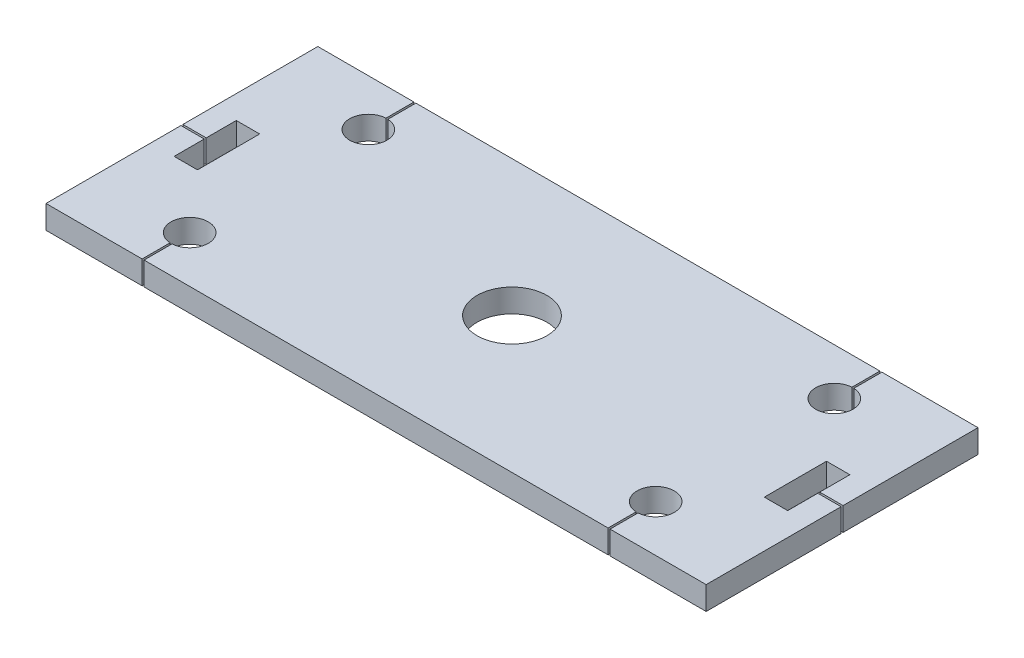
ISO-10303-21;
HEADER;
FILE_DESCRIPTION(('STEP AP214'),'2;1');
FILE_NAME('part.step','',(''),(''),'','','');
FILE_SCHEMA(('AUTOMOTIVE_DESIGN { 1 0 10303 214 1 1 1 1 }'));
ENDSEC;
DATA;
#1=APPLICATION_CONTEXT('core data for automotive mechanical design processes');
#2=APPLICATION_PROTOCOL_DEFINITION('international standard','automotive_design',2000,#1);
#3=PRODUCT_CONTEXT('',#1,'mechanical');
#4=PRODUCT('Part','Part','',(#3));
#5=PRODUCT_RELATED_PRODUCT_CATEGORY('part','',(#4));
#6=PRODUCT_DEFINITION_FORMATION('','',#4);
#7=PRODUCT_DEFINITION_CONTEXT('part definition',#1,'design');
#8=PRODUCT_DEFINITION('design','',#6,#7);
#9=PRODUCT_DEFINITION_SHAPE('','',#8);
#10=(LENGTH_UNIT() NAMED_UNIT(*) SI_UNIT(.MILLI.,.METRE.));
#11=(NAMED_UNIT(*) PLANE_ANGLE_UNIT() SI_UNIT($,.RADIAN.));
#12=(NAMED_UNIT(*) SI_UNIT($,.STERADIAN.) SOLID_ANGLE_UNIT());
#13=UNCERTAINTY_MEASURE_WITH_UNIT(LENGTH_MEASURE(1.E-05),#10,'distance_accuracy_value','');
#14=(GEOMETRIC_REPRESENTATION_CONTEXT(3) GLOBAL_UNCERTAINTY_ASSIGNED_CONTEXT((#13)) GLOBAL_UNIT_ASSIGNED_CONTEXT((#10,
#11,#12)) REPRESENTATION_CONTEXT('',''));
#15=CARTESIAN_POINT('',(0.,0.,0.));
#16=DIRECTION('',(0.,0.,1.));
#17=DIRECTION('',(1.,0.,0.));
#18=AXIS2_PLACEMENT_3D('',#15,#16,#17);
#19=CARTESIAN_POINT('',(42.5,3.,-17.5));
#20=DIRECTION('',(0.,0.,1.));
#21=DIRECTION('',(1.,0.,0.));
#22=AXIS2_PLACEMENT_3D('',#19,#20,#21);
#23=PLANE('',#22);
#24=DIRECTION('',(-1.,0.,0.));
#25=VECTOR('',#24,1.);
#26=CARTESIAN_POINT('',(42.5,0.,-17.5));
#27=LINE('',#26,#25);
#28=CARTESIAN_POINT('',(42.5,0.,-17.5));
#29=VERTEX_POINT('',#28);
#30=CARTESIAN_POINT('',(30.125,0.,-17.5));
#31=VERTEX_POINT('',#30);
#32=EDGE_CURVE('E287',#29,#31,#27,.T.);
#33=ORIENTED_EDGE('',*,*,#32,.T.);
#34=DIRECTION('',(0.,1.,0.));
#35=VECTOR('',#34,1.);
#36=CARTESIAN_POINT('',(30.125,0.,-17.5));
#37=LINE('',#36,#35);
#38=CARTESIAN_POINT('',(30.125,3.,-17.5));
#39=VERTEX_POINT('',#38);
#40=EDGE_CURVE('E270',#31,#39,#37,.T.);
#41=ORIENTED_EDGE('',*,*,#40,.T.);
#42=DIRECTION('',(-1.,0.,0.));
#43=VECTOR('',#42,1.);
#44=CARTESIAN_POINT('',(42.5,3.,-17.5));
#45=LINE('',#44,#43);
#46=CARTESIAN_POINT('',(42.5,3.,-17.5));
#47=VERTEX_POINT('',#46);
#48=EDGE_CURVE('E325',#47,#39,#45,.T.);
#49=ORIENTED_EDGE('',*,*,#48,.F.);
#50=DIRECTION('',(0.,-1.,0.));
#51=VECTOR('',#50,1.);
#52=CARTESIAN_POINT('',(42.5,3.,-17.5));
#53=LINE('',#52,#51);
#54=EDGE_CURVE('E294',#47,#29,#53,.T.);
#55=ORIENTED_EDGE('',*,*,#54,.T.);
#56=EDGE_LOOP('',(#33,#41,#49,#55));
#57=FACE_BOUND('',#56,.T.);
#58=ADVANCED_FACE('F37',(#57),#23,.F.);
#59=CARTESIAN_POINT('',(42.5,3.,-17.5));
#60=DIRECTION('',(-1.,0.,0.));
#61=DIRECTION('',(0.,0.,1.));
#62=AXIS2_PLACEMENT_3D('',#59,#60,#61);
#63=PLANE('',#62);
#64=DIRECTION('',(0.,0.,-1.));
#65=VECTOR('',#64,1.);
#66=CARTESIAN_POINT('',(42.5,3.,-17.5));
#67=LINE('',#66,#65);
#68=CARTESIAN_POINT('',(42.5,3.,-0.125));
#69=VERTEX_POINT('',#68);
#70=EDGE_CURVE('E333',#69,#47,#67,.T.);
#71=ORIENTED_EDGE('',*,*,#70,.F.);
#72=DIRECTION('',(0.,1.,0.));
#73=VECTOR('',#72,1.);
#74=CARTESIAN_POINT('',(42.5,0.,-0.125));
#75=LINE('',#74,#73);
#76=CARTESIAN_POINT('',(42.5,0.,-0.125));
#77=VERTEX_POINT('',#76);
#78=EDGE_CURVE('E520',#77,#69,#75,.T.);
#79=ORIENTED_EDGE('',*,*,#78,.F.);
#80=DIRECTION('',(0.,0.,-1.));
#81=VECTOR('',#80,1.);
#82=CARTESIAN_POINT('',(42.5,0.,-17.5));
#83=LINE('',#82,#81);
#84=EDGE_CURVE('E310',#77,#29,#83,.T.);
#85=ORIENTED_EDGE('',*,*,#84,.T.);
#86=ORIENTED_EDGE('',*,*,#54,.F.);
#87=EDGE_LOOP('',(#71,#79,#85,#86));
#88=FACE_BOUND('',#87,.T.);
#89=ADVANCED_FACE('F715',(#88),#63,.F.);
#90=CARTESIAN_POINT('',(39.5,3.,4.0025));
#91=DIRECTION('',(1.,0.,0.));
#92=DIRECTION('',(0.,0.,-1.));
#93=AXIS2_PLACEMENT_3D('',#90,#91,#92);
#94=PLANE('',#93);
#95=DIRECTION('',(0.,0.,1.));
#96=VECTOR('',#95,1.);
#97=CARTESIAN_POINT('',(39.5,0.,4.0025));
#98=LINE('',#97,#96);
#99=CARTESIAN_POINT('',(39.5,0.,-4.0025));
#100=VERTEX_POINT('',#99);
#101=CARTESIAN_POINT('',(39.5,0.,-0.12500000000002));
#102=VERTEX_POINT('',#101);
#103=EDGE_CURVE('E390',#100,#102,#98,.T.);
#104=ORIENTED_EDGE('',*,*,#103,.T.);
#105=DIRECTION('',(0.,1.,0.));
#106=VECTOR('',#105,1.);
#107=CARTESIAN_POINT('',(39.5,0.,-0.12500000000002));
#108=LINE('',#107,#106);
#109=CARTESIAN_POINT('',(39.5,3.,-0.12500000000002));
#110=VERTEX_POINT('',#109);
#111=EDGE_CURVE('E536',#102,#110,#108,.T.);
#112=ORIENTED_EDGE('',*,*,#111,.T.);
#113=DIRECTION('',(0.,0.,1.));
#114=VECTOR('',#113,1.);
#115=CARTESIAN_POINT('',(39.5,3.,4.0025));
#116=LINE('',#115,#114);
#117=CARTESIAN_POINT('',(39.5,3.,-4.0025));
#118=VERTEX_POINT('',#117);
#119=EDGE_CURVE('E402',#118,#110,#116,.T.);
#120=ORIENTED_EDGE('',*,*,#119,.F.);
#121=DIRECTION('',(0.,-1.,0.));
#122=VECTOR('',#121,1.);
#123=CARTESIAN_POINT('',(39.5,3.,-4.0025));
#124=LINE('',#123,#122);
#125=EDGE_CURVE('E379',#118,#100,#124,.T.);
#126=ORIENTED_EDGE('',*,*,#125,.T.);
#127=EDGE_LOOP('',(#104,#112,#120,#126));
#128=FACE_BOUND('',#127,.T.);
#129=ADVANCED_FACE('F717',(#128),#94,.F.);
#130=CARTESIAN_POINT('',(42.5,3.,17.5));
#131=DIRECTION('',(0.,0.,-1.));
#132=DIRECTION('',(-1.,0.,0.));
#133=AXIS2_PLACEMENT_3D('',#130,#131,#132);
#134=PLANE('',#133);
#135=DIRECTION('',(1.,0.,0.));
#136=VECTOR('',#135,1.);
#137=CARTESIAN_POINT('',(42.5,0.,17.5));
#138=LINE('',#137,#136);
#139=CARTESIAN_POINT('',(-29.875,0.,17.5));
#140=VERTEX_POINT('',#139);
#141=CARTESIAN_POINT('',(29.875,0.,17.5));
#142=VERTEX_POINT('',#141);
#143=EDGE_CURVE('E319',#140,#142,#138,.T.);
#144=ORIENTED_EDGE('',*,*,#143,.T.);
#145=DIRECTION('',(0.,1.,0.));
#146=VECTOR('',#145,1.);
#147=CARTESIAN_POINT('',(29.875,0.,17.5));
#148=LINE('',#147,#146);
#149=CARTESIAN_POINT('',(29.875,3.,17.5));
#150=VERTEX_POINT('',#149);
#151=EDGE_CURVE('E497',#142,#150,#148,.T.);
#152=ORIENTED_EDGE('',*,*,#151,.T.);
#153=DIRECTION('',(1.,0.,0.));
#154=VECTOR('',#153,1.);
#155=CARTESIAN_POINT('',(42.5,3.,17.5));
#156=LINE('',#155,#154);
#157=CARTESIAN_POINT('',(-29.875,3.,17.5));
#158=VERTEX_POINT('',#157);
#159=EDGE_CURVE('E336',#158,#150,#156,.T.);
#160=ORIENTED_EDGE('',*,*,#159,.F.);
#161=DIRECTION('',(0.,1.,0.));
#162=VECTOR('',#161,1.);
#163=CARTESIAN_POINT('',(-29.875,0.,17.5));
#164=LINE('',#163,#162);
#165=EDGE_CURVE('E493',#140,#158,#164,.T.);
#166=ORIENTED_EDGE('',*,*,#165,.F.);
#167=EDGE_LOOP('',(#144,#152,#160,#166));
#168=FACE_BOUND('',#167,.T.);
#169=ADVANCED_FACE('F698',(#168),#134,.F.);
#170=CARTESIAN_POINT('',(-42.5,0.,17.5));
#171=VERTEX_POINT('',#170);
#172=CARTESIAN_POINT('',(-30.125,0.,17.5));
#173=VERTEX_POINT('',#172);
#174=EDGE_CURVE('E315',#171,#173,#138,.T.);
#175=ORIENTED_EDGE('',*,*,#174,.T.);
#176=DIRECTION('',(0.,1.,0.));
#177=VECTOR('',#176,1.);
#178=CARTESIAN_POINT('',(-30.125,0.,17.5));
#179=LINE('',#178,#177);
#180=CARTESIAN_POINT('',(-30.125,3.,17.5));
#181=VERTEX_POINT('',#180);
#182=EDGE_CURVE('E477',#173,#181,#179,.T.);
#183=ORIENTED_EDGE('',*,*,#182,.T.);
#184=CARTESIAN_POINT('',(-42.5,3.,17.5));
#185=VERTEX_POINT('',#184);
#186=EDGE_CURVE('E334',#185,#181,#156,.T.);
#187=ORIENTED_EDGE('',*,*,#186,.F.);
#188=DIRECTION('',(0.,-1.,0.));
#189=VECTOR('',#188,1.);
#190=CARTESIAN_POINT('',(-42.5,3.,17.5));
#191=LINE('',#190,#189);
#192=EDGE_CURVE('E11',#185,#171,#191,.T.);
#193=ORIENTED_EDGE('',*,*,#192,.T.);
#194=EDGE_LOOP('',(#175,#183,#187,#193));
#195=FACE_BOUND('',#194,.T.);
#196=ADVANCED_FACE('F629',(#195),#134,.F.);
#197=CARTESIAN_POINT('',(-42.5,3.,-17.5));
#198=DIRECTION('',(1.,0.,0.));
#199=DIRECTION('',(0.,0.,-1.));
#200=AXIS2_PLACEMENT_3D('',#197,#198,#199);
#201=PLANE('',#200);
#202=DIRECTION('',(0.,0.,1.));
#203=VECTOR('',#202,1.);
#204=CARTESIAN_POINT('',(-42.5,3.,-17.5));
#205=LINE('',#204,#203);
#206=CARTESIAN_POINT('',(-42.5,3.,0.125));
#207=VERTEX_POINT('',#206);
#208=EDGE_CURVE('E295',#207,#185,#205,.T.);
#209=ORIENTED_EDGE('',*,*,#208,.F.);
#210=DIRECTION('',(0.,1.,0.));
#211=VECTOR('',#210,1.);
#212=CARTESIAN_POINT('',(-42.5,0.,0.125));
#213=LINE('',#212,#211);
#214=CARTESIAN_POINT('',(-42.5,0.,0.125));
#215=VERTEX_POINT('',#214);
#216=EDGE_CURVE('E458',#215,#207,#213,.T.);
#217=ORIENTED_EDGE('',*,*,#216,.F.);
#218=DIRECTION('',(0.,0.,1.));
#219=VECTOR('',#218,1.);
#220=CARTESIAN_POINT('',(-42.5,0.,-17.5));
#221=LINE('',#220,#219);
#222=EDGE_CURVE('E324',#215,#171,#221,.T.);
#223=ORIENTED_EDGE('',*,*,#222,.T.);
#224=ORIENTED_EDGE('',*,*,#192,.F.);
#225=EDGE_LOOP('',(#209,#217,#223,#224));
#226=FACE_BOUND('',#225,.T.);
#227=ADVANCED_FACE('F625',(#226),#201,.F.);
#228=CARTESIAN_POINT('',(-39.5,3.,4.0025));
#229=DIRECTION('',(-1.,0.,0.));
#230=DIRECTION('',(0.,0.,1.));
#231=AXIS2_PLACEMENT_3D('',#228,#229,#230);
#232=PLANE('',#231);
#233=DIRECTION('',(0.,0.,-1.));
#234=VECTOR('',#233,1.);
#235=CARTESIAN_POINT('',(-39.5,0.,4.0025));
#236=LINE('',#235,#234);
#237=CARTESIAN_POINT('',(-39.5,0.,4.0025));
#238=VERTEX_POINT('',#237);
#239=CARTESIAN_POINT('',(-39.5,0.,0.125));
#240=VERTEX_POINT('',#239);
#241=EDGE_CURVE('E355',#238,#240,#236,.T.);
#242=ORIENTED_EDGE('',*,*,#241,.T.);
#243=DIRECTION('',(0.,1.,0.));
#244=VECTOR('',#243,1.);
#245=CARTESIAN_POINT('',(-39.5,0.,0.125));
#246=LINE('',#245,#244);
#247=CARTESIAN_POINT('',(-39.5,3.,0.125));
#248=VERTEX_POINT('',#247);
#249=EDGE_CURVE('E435',#240,#248,#246,.T.);
#250=ORIENTED_EDGE('',*,*,#249,.T.);
#251=DIRECTION('',(0.,0.,-1.));
#252=VECTOR('',#251,1.);
#253=CARTESIAN_POINT('',(-39.5,3.,4.0025));
#254=LINE('',#253,#252);
#255=CARTESIAN_POINT('',(-39.5,3.,4.0025));
#256=VERTEX_POINT('',#255);
#257=EDGE_CURVE('E367',#256,#248,#254,.T.);
#258=ORIENTED_EDGE('',*,*,#257,.F.);
#259=DIRECTION('',(0.,-1.,0.));
#260=VECTOR('',#259,1.);
#261=CARTESIAN_POINT('',(-39.5,3.,4.0025));
#262=LINE('',#261,#260);
#263=EDGE_CURVE('E343',#256,#238,#262,.T.);
#264=ORIENTED_EDGE('',*,*,#263,.T.);
#265=EDGE_LOOP('',(#242,#250,#258,#264));
#266=FACE_BOUND('',#265,.T.);
#267=ADVANCED_FACE('F617',(#266),#232,.F.);
#268=CARTESIAN_POINT('',(29.875,3.,-17.5));
#269=VERTEX_POINT('',#268);
#270=CARTESIAN_POINT('',(-29.875,3.,-17.5));
#271=VERTEX_POINT('',#270);
#272=EDGE_CURVE('E328',#269,#271,#45,.T.);
#273=ORIENTED_EDGE('',*,*,#272,.F.);
#274=DIRECTION('',(0.,1.,0.));
#275=VECTOR('',#274,1.);
#276=CARTESIAN_POINT('',(29.875,0.,-17.5));
#277=LINE('',#276,#275);
#278=CARTESIAN_POINT('',(29.875,0.,-17.5));
#279=VERTEX_POINT('',#278);
#280=EDGE_CURVE('E278',#279,#269,#277,.T.);
#281=ORIENTED_EDGE('',*,*,#280,.F.);
#282=CARTESIAN_POINT('',(-29.875,0.,-17.5));
#283=VERTEX_POINT('',#282);
#284=EDGE_CURVE('E296',#279,#283,#27,.T.);
#285=ORIENTED_EDGE('',*,*,#284,.T.);
#286=DIRECTION('',(0.,1.,0.));
#287=VECTOR('',#286,1.);
#288=CARTESIAN_POINT('',(-29.875,0.,-17.5));
#289=LINE('',#288,#287);
#290=EDGE_CURVE('E418',#283,#271,#289,.T.);
#291=ORIENTED_EDGE('',*,*,#290,.T.);
#292=EDGE_LOOP('',(#273,#281,#285,#291));
#293=FACE_BOUND('',#292,.T.);
#294=ADVANCED_FACE('F584',(#293),#23,.F.);
#295=CARTESIAN_POINT('',(-42.5,0.,-17.5));
#296=VERTEX_POINT('',#295);
#297=CARTESIAN_POINT('',(-42.5,0.,-0.125));
#298=VERTEX_POINT('',#297);
#299=EDGE_CURVE('E321',#296,#298,#221,.T.);
#300=ORIENTED_EDGE('',*,*,#299,.T.);
#301=DIRECTION('',(0.,1.,0.));
#302=VECTOR('',#301,1.);
#303=CARTESIAN_POINT('',(-42.5,0.,-0.125));
#304=LINE('',#303,#302);
#305=CARTESIAN_POINT('',(-42.5,3.,-0.125));
#306=VERTEX_POINT('',#305);
#307=EDGE_CURVE('E454',#298,#306,#304,.T.);
#308=ORIENTED_EDGE('',*,*,#307,.T.);
#309=CARTESIAN_POINT('',(-42.5,3.,-17.5));
#310=VERTEX_POINT('',#309);
#311=EDGE_CURVE('E299',#310,#306,#205,.T.);
#312=ORIENTED_EDGE('',*,*,#311,.F.);
#313=DIRECTION('',(0.,-1.,0.));
#314=VECTOR('',#313,1.);
#315=CARTESIAN_POINT('',(-42.5,3.,-17.5));
#316=LINE('',#315,#314);
#317=EDGE_CURVE('E327',#310,#296,#316,.T.);
#318=ORIENTED_EDGE('',*,*,#317,.T.);
#319=EDGE_LOOP('',(#300,#308,#312,#318));
#320=FACE_BOUND('',#319,.T.);
#321=ADVANCED_FACE('F39',(#320),#201,.F.);
#322=CARTESIAN_POINT('',(30.125,3.,17.5));
#323=VERTEX_POINT('',#322);
#324=CARTESIAN_POINT('',(42.5,3.,17.5));
#325=VERTEX_POINT('',#324);
#326=EDGE_CURVE('E337',#323,#325,#156,.T.);
#327=ORIENTED_EDGE('',*,*,#326,.F.);
#328=DIRECTION('',(0.,1.,0.));
#329=VECTOR('',#328,1.);
#330=CARTESIAN_POINT('',(30.125,0.,17.5));
#331=LINE('',#330,#329);
#332=CARTESIAN_POINT('',(30.125,0.,17.5));
#333=VERTEX_POINT('',#332);
#334=EDGE_CURVE('E515',#333,#323,#331,.T.);
#335=ORIENTED_EDGE('',*,*,#334,.F.);
#336=CARTESIAN_POINT('',(42.5,0.,17.5));
#337=VERTEX_POINT('',#336);
#338=EDGE_CURVE('E320',#333,#337,#138,.T.);
#339=ORIENTED_EDGE('',*,*,#338,.T.);
#340=DIRECTION('',(0.,-1.,0.));
#341=VECTOR('',#340,1.);
#342=CARTESIAN_POINT('',(42.5,3.,17.5));
#343=LINE('',#342,#341);
#344=EDGE_CURVE('E46',#325,#337,#343,.T.);
#345=ORIENTED_EDGE('',*,*,#344,.F.);
#346=EDGE_LOOP('',(#327,#335,#339,#345));
#347=FACE_BOUND('',#346,.T.);
#348=ADVANCED_FACE('F708',(#347),#134,.F.);
#349=CARTESIAN_POINT('',(42.5,0.,0.125));
#350=VERTEX_POINT('',#349);
#351=EDGE_CURVE('E303',#337,#350,#83,.T.);
#352=ORIENTED_EDGE('',*,*,#351,.T.);
#353=DIRECTION('',(0.,1.,0.));
#354=VECTOR('',#353,1.);
#355=CARTESIAN_POINT('',(42.5,0.,0.125));
#356=LINE('',#355,#354);
#357=CARTESIAN_POINT('',(42.5,3.,0.125));
#358=VERTEX_POINT('',#357);
#359=EDGE_CURVE('E542',#350,#358,#356,.T.);
#360=ORIENTED_EDGE('',*,*,#359,.T.);
#361=EDGE_CURVE('E330',#325,#358,#67,.T.);
#362=ORIENTED_EDGE('',*,*,#361,.F.);
#363=ORIENTED_EDGE('',*,*,#344,.T.);
#364=EDGE_LOOP('',(#352,#360,#362,#363));
#365=FACE_BOUND('',#364,.T.);
#366=ADVANCED_FACE('F674',(#365),#63,.F.);
#367=CARTESIAN_POINT('',(-30.125,3.,-17.5));
#368=VERTEX_POINT('',#367);
#369=EDGE_CURVE('E329',#368,#310,#45,.T.);
#370=ORIENTED_EDGE('',*,*,#369,.F.);
#371=DIRECTION('',(0.,1.,0.));
#372=VECTOR('',#371,1.);
#373=CARTESIAN_POINT('',(-30.125,0.,-17.5));
#374=LINE('',#373,#372);
#375=CARTESIAN_POINT('',(-30.125,0.,-17.5));
#376=VERTEX_POINT('',#375);
#377=EDGE_CURVE('E430',#376,#368,#374,.T.);
#378=ORIENTED_EDGE('',*,*,#377,.F.);
#379=EDGE_CURVE('E298',#376,#296,#27,.T.);
#380=ORIENTED_EDGE('',*,*,#379,.T.);
#381=ORIENTED_EDGE('',*,*,#317,.F.);
#382=EDGE_LOOP('',(#370,#378,#380,#381));
#383=FACE_BOUND('',#382,.T.);
#384=ADVANCED_FACE('F591',(#383),#23,.F.);
#385=CARTESIAN_POINT('',(0.,3.,0.));
#386=DIRECTION('',(0.,-1.,0.));
#387=DIRECTION('',(0.,0.,-1.));
#388=AXIS2_PLACEMENT_3D('',#385,#386,#387);
#389=PLANE('',#388);
#390=CARTESIAN_POINT('',(0.,3.,0.));
#391=DIRECTION('',(0.,1.,0.));
#392=DIRECTION('',(0.,0.,1.));
#393=AXIS2_PLACEMENT_3D('',#390,#391,#392);
#394=CIRCLE('',#393,4.5);
#395=CARTESIAN_POINT('',(0.,3.,4.5));
#396=VERTEX_POINT('',#395);
#397=EDGE_CURVE('E415',#396,#396,#394,.T.);
#398=ORIENTED_EDGE('',*,*,#397,.F.);
#399=EDGE_LOOP('',(#398));
#400=FACE_BOUND('',#399,.T.);
#401=ORIENTED_EDGE('',*,*,#48,.T.);
#402=DIRECTION('',(0.,0.,-1.));
#403=VECTOR('',#402,1.);
#404=CARTESIAN_POINT('',(30.125,3.,-17.5));
#405=LINE('',#404,#403);
#406=CARTESIAN_POINT('',(30.125,3.,-13.8967425810879));
#407=VERTEX_POINT('',#406);
#408=EDGE_CURVE('E273',#407,#39,#405,.T.);
#409=ORIENTED_EDGE('',*,*,#408,.F.);
#410=CARTESIAN_POINT('',(30.,3.,-11.5));
#411=DIRECTION('',(0.,-1.,0.));
#412=DIRECTION('',(0.,0.,-1.));
#413=AXIS2_PLACEMENT_3D('',#410,#411,#412);
#414=CIRCLE('',#413,2.4);
#415=CARTESIAN_POINT('',(29.8750000000005,3.,-13.8967425810879));
#416=VERTEX_POINT('',#415);
#417=EDGE_CURVE('E583',#407,#416,#414,.T.);
#418=ORIENTED_EDGE('',*,*,#417,.T.);
#419=DIRECTION('',(0.,0.,1.));
#420=VECTOR('',#419,1.);
#421=CARTESIAN_POINT('',(29.875,3.,-17.5));
#422=LINE('',#421,#420);
#423=EDGE_CURVE('E62',#269,#416,#422,.T.);
#424=ORIENTED_EDGE('',*,*,#423,.F.);
#425=ORIENTED_EDGE('',*,*,#272,.T.);
#426=DIRECTION('',(0.,0.,-1.));
#427=VECTOR('',#426,1.);
#428=CARTESIAN_POINT('',(-29.875,3.,-17.5));
#429=LINE('',#428,#427);
#430=CARTESIAN_POINT('',(-29.875,3.,-13.8967425810879));
#431=VERTEX_POINT('',#430);
#432=EDGE_CURVE('E425',#431,#271,#429,.T.);
#433=ORIENTED_EDGE('',*,*,#432,.F.);
#434=CARTESIAN_POINT('',(-30.,3.,-11.5));
#435=DIRECTION('',(0.,-1.,0.));
#436=DIRECTION('',(0.,0.,-1.));
#437=AXIS2_PLACEMENT_3D('',#434,#435,#436);
#438=CIRCLE('',#437,2.4);
#439=CARTESIAN_POINT('',(-30.1249999999999,3.,-13.8967425810879));
#440=VERTEX_POINT('',#439);
#441=EDGE_CURVE('E644',#431,#440,#438,.T.);
#442=ORIENTED_EDGE('',*,*,#441,.T.);
#443=DIRECTION('',(0.,0.,1.));
#444=VECTOR('',#443,1.);
#445=CARTESIAN_POINT('',(-30.125,3.,-17.5));
#446=LINE('',#445,#444);
#447=EDGE_CURVE('E433',#368,#440,#446,.T.);
#448=ORIENTED_EDGE('',*,*,#447,.F.);
#449=ORIENTED_EDGE('',*,*,#369,.T.);
#450=ORIENTED_EDGE('',*,*,#311,.T.);
#451=DIRECTION('',(-1.,0.,0.));
#452=VECTOR('',#451,1.);
#453=CARTESIAN_POINT('',(-39.5,3.,-0.125));
#454=LINE('',#453,#452);
#455=CARTESIAN_POINT('',(-39.5,3.,-0.125));
#456=VERTEX_POINT('',#455);
#457=EDGE_CURVE('E465',#456,#306,#454,.T.);
#458=ORIENTED_EDGE('',*,*,#457,.F.);
#459=CARTESIAN_POINT('',(-39.5,3.,-4.0025));
#460=VERTEX_POINT('',#459);
#461=EDGE_CURVE('E370',#456,#460,#254,.T.);
#462=ORIENTED_EDGE('',*,*,#461,.T.);
#463=DIRECTION('',(1.,0.,0.));
#464=VECTOR('',#463,1.);
#465=CARTESIAN_POINT('',(-36.49,3.,-4.0025));
#466=LINE('',#465,#464);
#467=CARTESIAN_POINT('',(-36.49,3.,-4.0025));
#468=VERTEX_POINT('',#467);
#469=EDGE_CURVE('E344',#460,#468,#466,.T.);
#470=ORIENTED_EDGE('',*,*,#469,.T.);
#471=DIRECTION('',(0.,0.,1.));
#472=VECTOR('',#471,1.);
#473=CARTESIAN_POINT('',(-36.49,3.,4.0025));
#474=LINE('',#473,#472);
#475=CARTESIAN_POINT('',(-36.49,3.,4.0025));
#476=VERTEX_POINT('',#475);
#477=EDGE_CURVE('E354',#468,#476,#474,.T.);
#478=ORIENTED_EDGE('',*,*,#477,.T.);
#479=DIRECTION('',(-1.,0.,0.));
#480=VECTOR('',#479,1.);
#481=CARTESIAN_POINT('',(-36.49,3.,4.0025));
#482=LINE('',#481,#480);
#483=EDGE_CURVE('E371',#476,#256,#482,.T.);
#484=ORIENTED_EDGE('',*,*,#483,.T.);
#485=ORIENTED_EDGE('',*,*,#257,.T.);
#486=DIRECTION('',(1.,0.,0.));
#487=VECTOR('',#486,1.);
#488=CARTESIAN_POINT('',(-39.5,3.,0.125));
#489=LINE('',#488,#487);
#490=EDGE_CURVE('E462',#207,#248,#489,.T.);
#491=ORIENTED_EDGE('',*,*,#490,.F.);
#492=ORIENTED_EDGE('',*,*,#208,.T.);
#493=ORIENTED_EDGE('',*,*,#186,.T.);
#494=DIRECTION('',(0.,0.,1.));
#495=VECTOR('',#494,1.);
#496=CARTESIAN_POINT('',(-30.125,3.,17.5));
#497=LINE('',#496,#495);
#498=CARTESIAN_POINT('',(-30.125,3.,13.8967425810879));
#499=VERTEX_POINT('',#498);
#500=EDGE_CURVE('E487',#499,#181,#497,.T.);
#501=ORIENTED_EDGE('',*,*,#500,.F.);
#502=CARTESIAN_POINT('',(-30.,3.,11.5));
#503=DIRECTION('',(0.,-1.,0.));
#504=DIRECTION('',(0.,0.,-1.));
#505=AXIS2_PLACEMENT_3D('',#502,#503,#504);
#506=CIRCLE('',#505,2.4);
#507=CARTESIAN_POINT('',(-29.8750000000006,3.,13.896742581088));
#508=VERTEX_POINT('',#507);
#509=EDGE_CURVE('E634',#499,#508,#506,.T.);
#510=ORIENTED_EDGE('',*,*,#509,.T.);
#511=DIRECTION('',(0.,0.,-1.));
#512=VECTOR('',#511,1.);
#513=CARTESIAN_POINT('',(-29.875,3.,17.5));
#514=LINE('',#513,#512);
#515=EDGE_CURVE('E483',#158,#508,#514,.T.);
#516=ORIENTED_EDGE('',*,*,#515,.F.);
#517=ORIENTED_EDGE('',*,*,#159,.T.);
#518=DIRECTION('',(0.,0.,1.));
#519=VECTOR('',#518,1.);
#520=CARTESIAN_POINT('',(29.875,3.,17.5));
#521=LINE('',#520,#519);
#522=CARTESIAN_POINT('',(29.875,3.,13.8967425810879));
#523=VERTEX_POINT('',#522);
#524=EDGE_CURVE('E510',#523,#150,#521,.T.);
#525=ORIENTED_EDGE('',*,*,#524,.F.);
#526=CARTESIAN_POINT('',(30.,3.,11.5));
#527=DIRECTION('',(0.,-1.,0.));
#528=DIRECTION('',(0.,0.,-1.));
#529=AXIS2_PLACEMENT_3D('',#526,#527,#528);
#530=CIRCLE('',#529,2.4);
#531=CARTESIAN_POINT('',(30.1249999999997,3.,13.8967425810879));
#532=VERTEX_POINT('',#531);
#533=EDGE_CURVE('E399',#523,#532,#530,.T.);
#534=ORIENTED_EDGE('',*,*,#533,.T.);
#535=DIRECTION('',(0.,0.,-1.));
#536=VECTOR('',#535,1.);
#537=CARTESIAN_POINT('',(30.125,3.,17.5));
#538=LINE('',#537,#536);
#539=EDGE_CURVE('E518',#323,#532,#538,.T.);
#540=ORIENTED_EDGE('',*,*,#539,.F.);
#541=ORIENTED_EDGE('',*,*,#326,.T.);
#542=ORIENTED_EDGE('',*,*,#361,.T.);
#543=DIRECTION('',(1.,0.,0.));
#544=VECTOR('',#543,1.);
#545=CARTESIAN_POINT('',(39.5,3.,0.125));
#546=LINE('',#545,#544);
#547=CARTESIAN_POINT('',(39.5,3.,0.125));
#548=VERTEX_POINT('',#547);
#549=EDGE_CURVE('E545',#548,#358,#546,.T.);
#550=ORIENTED_EDGE('',*,*,#549,.F.);
#551=CARTESIAN_POINT('',(39.5,3.,4.0025));
#552=VERTEX_POINT('',#551);
#553=EDGE_CURVE('E405',#548,#552,#116,.T.);
#554=ORIENTED_EDGE('',*,*,#553,.T.);
#555=DIRECTION('',(-1.,0.,0.));
#556=VECTOR('',#555,1.);
#557=CARTESIAN_POINT('',(36.49,3.,4.0025));
#558=LINE('',#557,#556);
#559=CARTESIAN_POINT('',(36.49,3.,4.0025));
#560=VERTEX_POINT('',#559);
#561=EDGE_CURVE('E380',#552,#560,#558,.T.);
#562=ORIENTED_EDGE('',*,*,#561,.T.);
#563=DIRECTION('',(0.,0.,-1.));
#564=VECTOR('',#563,1.);
#565=CARTESIAN_POINT('',(36.49,3.,4.0025));
#566=LINE('',#565,#564);
#567=CARTESIAN_POINT('',(36.49,3.,-4.0025));
#568=VERTEX_POINT('',#567);
#569=EDGE_CURVE('E389',#560,#568,#566,.T.);
#570=ORIENTED_EDGE('',*,*,#569,.T.);
#571=DIRECTION('',(1.,0.,0.));
#572=VECTOR('',#571,1.);
#573=CARTESIAN_POINT('',(36.49,3.,-4.0025));
#574=LINE('',#573,#572);
#575=EDGE_CURVE('E406',#568,#118,#574,.T.);
#576=ORIENTED_EDGE('',*,*,#575,.T.);
#577=ORIENTED_EDGE('',*,*,#119,.T.);
#578=DIRECTION('',(-1.,0.,0.));
#579=VECTOR('',#578,1.);
#580=CARTESIAN_POINT('',(39.5,3.,-0.12500000000002));
#581=LINE('',#580,#579);
#582=EDGE_CURVE('E548',#69,#110,#581,.T.);
#583=ORIENTED_EDGE('',*,*,#582,.F.);
#584=ORIENTED_EDGE('',*,*,#70,.T.);
#585=EDGE_LOOP('',(#401,#409,#418,#424,#425,#433,#442,#448,#449,#450,#458,#462,#470,#478,#484,
#485,#491,#492,#493,#501,#510,#516,#517,#525,#534,#540,#541,#542,#550,#554,#562,#570,#576,#577,
#583,#584));
#586=FACE_BOUND('',#585,.T.);
#587=ADVANCED_FACE('F580',(#400,#586),#389,.F.);
#588=CARTESIAN_POINT('',(0.,0.,0.));
#589=DIRECTION('',(0.,-1.,0.));
#590=DIRECTION('',(0.,0.,-1.));
#591=AXIS2_PLACEMENT_3D('',#588,#589,#590);
#592=PLANE('',#591);
#593=DIRECTION('',(0.,0.,-1.));
#594=VECTOR('',#593,1.);
#595=CARTESIAN_POINT('',(30.125,0.,-17.5));
#596=LINE('',#595,#594);
#597=CARTESIAN_POINT('',(30.125,0.,-13.8967425810879));
#598=VERTEX_POINT('',#597);
#599=EDGE_CURVE('E54',#598,#31,#596,.T.);
#600=ORIENTED_EDGE('',*,*,#599,.T.);
#601=ORIENTED_EDGE('',*,*,#32,.F.);
#602=ORIENTED_EDGE('',*,*,#84,.F.);
#603=DIRECTION('',(-1.,0.,0.));
#604=VECTOR('',#603,1.);
#605=CARTESIAN_POINT('',(39.5,0.,-0.12500000000002));
#606=LINE('',#605,#604);
#607=EDGE_CURVE('E547',#77,#102,#606,.T.);
#608=ORIENTED_EDGE('',*,*,#607,.T.);
#609=ORIENTED_EDGE('',*,*,#103,.F.);
#610=DIRECTION('',(1.,0.,0.));
#611=VECTOR('',#610,1.);
#612=CARTESIAN_POINT('',(36.49,0.,-4.0025));
#613=LINE('',#612,#611);
#614=CARTESIAN_POINT('',(36.49,0.,-4.0025));
#615=VERTEX_POINT('',#614);
#616=EDGE_CURVE('E394',#615,#100,#613,.T.);
#617=ORIENTED_EDGE('',*,*,#616,.F.);
#618=DIRECTION('',(0.,0.,-1.));
#619=VECTOR('',#618,1.);
#620=CARTESIAN_POINT('',(36.49,0.,4.0025));
#621=LINE('',#620,#619);
#622=CARTESIAN_POINT('',(36.49,0.,4.0025));
#623=VERTEX_POINT('',#622);
#624=EDGE_CURVE('E397',#623,#615,#621,.T.);
#625=ORIENTED_EDGE('',*,*,#624,.F.);
#626=DIRECTION('',(-1.,0.,0.));
#627=VECTOR('',#626,1.);
#628=CARTESIAN_POINT('',(36.49,0.,4.0025));
#629=LINE('',#628,#627);
#630=CARTESIAN_POINT('',(39.5,0.,4.0025));
#631=VERTEX_POINT('',#630);
#632=EDGE_CURVE('E386',#631,#623,#629,.T.);
#633=ORIENTED_EDGE('',*,*,#632,.F.);
#634=CARTESIAN_POINT('',(39.5,0.,0.125));
#635=VERTEX_POINT('',#634);
#636=EDGE_CURVE('E393',#635,#631,#98,.T.);
#637=ORIENTED_EDGE('',*,*,#636,.F.);
#638=DIRECTION('',(1.,0.,0.));
#639=VECTOR('',#638,1.);
#640=CARTESIAN_POINT('',(39.5,0.,0.125));
#641=LINE('',#640,#639);
#642=EDGE_CURVE('E540',#635,#350,#641,.T.);
#643=ORIENTED_EDGE('',*,*,#642,.T.);
#644=ORIENTED_EDGE('',*,*,#351,.F.);
#645=ORIENTED_EDGE('',*,*,#338,.F.);
#646=DIRECTION('',(0.,0.,-1.));
#647=VECTOR('',#646,1.);
#648=CARTESIAN_POINT('',(30.125,0.,17.5));
#649=LINE('',#648,#647);
#650=CARTESIAN_POINT('',(30.125,0.,13.8967425810879));
#651=VERTEX_POINT('',#650);
#652=EDGE_CURVE('E506',#333,#651,#649,.T.);
#653=ORIENTED_EDGE('',*,*,#652,.T.);
#654=CARTESIAN_POINT('',(30.,0.,11.5));
#655=DIRECTION('',(0.,-1.,0.));
#656=DIRECTION('',(0.,0.,-1.));
#657=AXIS2_PLACEMENT_3D('',#654,#655,#656);
#658=CIRCLE('',#657,2.39999999999999);
#659=CARTESIAN_POINT('',(29.875,0.,13.8967425810879));
#660=VERTEX_POINT('',#659);
#661=EDGE_CURVE('E656',#660,#651,#658,.T.);
#662=ORIENTED_EDGE('',*,*,#661,.F.);
#663=DIRECTION('',(0.,0.,1.));
#664=VECTOR('',#663,1.);
#665=CARTESIAN_POINT('',(29.875,0.,17.5));
#666=LINE('',#665,#664);
#667=EDGE_CURVE('E509',#660,#142,#666,.T.);
#668=ORIENTED_EDGE('',*,*,#667,.T.);
#669=ORIENTED_EDGE('',*,*,#143,.F.);
#670=DIRECTION('',(0.,0.,-1.));
#671=VECTOR('',#670,1.);
#672=CARTESIAN_POINT('',(-29.875,0.,17.5));
#673=LINE('',#672,#671);
#674=CARTESIAN_POINT('',(-29.875,0.,13.8967425810879));
#675=VERTEX_POINT('',#674);
#676=EDGE_CURVE('E474',#140,#675,#673,.T.);
#677=ORIENTED_EDGE('',*,*,#676,.T.);
#678=CARTESIAN_POINT('',(-30.,0.,11.5));
#679=DIRECTION('',(0.,-1.,0.));
#680=DIRECTION('',(0.,0.,-1.));
#681=AXIS2_PLACEMENT_3D('',#678,#679,#680);
#682=CIRCLE('',#681,2.39999999999999);
#683=CARTESIAN_POINT('',(-30.125,0.,13.8967425810879));
#684=VERTEX_POINT('',#683);
#685=EDGE_CURVE('E414',#684,#675,#682,.T.);
#686=ORIENTED_EDGE('',*,*,#685,.F.);
#687=DIRECTION('',(0.,0.,1.));
#688=VECTOR('',#687,1.);
#689=CARTESIAN_POINT('',(-30.125,0.,17.5));
#690=LINE('',#689,#688);
#691=EDGE_CURVE('E478',#684,#173,#690,.T.);
#692=ORIENTED_EDGE('',*,*,#691,.T.);
#693=ORIENTED_EDGE('',*,*,#174,.F.);
#694=ORIENTED_EDGE('',*,*,#222,.F.);
#695=DIRECTION('',(1.,0.,0.));
#696=VECTOR('',#695,1.);
#697=CARTESIAN_POINT('',(-39.5,0.,0.125));
#698=LINE('',#697,#696);
#699=EDGE_CURVE('E455',#215,#240,#698,.T.);
#700=ORIENTED_EDGE('',*,*,#699,.T.);
#701=ORIENTED_EDGE('',*,*,#241,.F.);
#702=DIRECTION('',(-1.,0.,0.));
#703=VECTOR('',#702,1.);
#704=CARTESIAN_POINT('',(-36.49,0.,4.0025));
#705=LINE('',#704,#703);
#706=CARTESIAN_POINT('',(-36.49,0.,4.0025));
#707=VERTEX_POINT('',#706);
#708=EDGE_CURVE('E359',#707,#238,#705,.T.);
#709=ORIENTED_EDGE('',*,*,#708,.F.);
#710=DIRECTION('',(0.,0.,1.));
#711=VECTOR('',#710,1.);
#712=CARTESIAN_POINT('',(-36.49,0.,4.0025));
#713=LINE('',#712,#711);
#714=CARTESIAN_POINT('',(-36.49,0.,-4.0025));
#715=VERTEX_POINT('',#714);
#716=EDGE_CURVE('E362',#715,#707,#713,.T.);
#717=ORIENTED_EDGE('',*,*,#716,.F.);
#718=DIRECTION('',(1.,0.,0.));
#719=VECTOR('',#718,1.);
#720=CARTESIAN_POINT('',(-36.49,0.,-4.0025));
#721=LINE('',#720,#719);
#722=CARTESIAN_POINT('',(-39.5,0.,-4.0025));
#723=VERTEX_POINT('',#722);
#724=EDGE_CURVE('E351',#723,#715,#721,.T.);
#725=ORIENTED_EDGE('',*,*,#724,.F.);
#726=CARTESIAN_POINT('',(-39.5,0.,-0.125));
#727=VERTEX_POINT('',#726);
#728=EDGE_CURVE('E358',#727,#723,#236,.T.);
#729=ORIENTED_EDGE('',*,*,#728,.F.);
#730=DIRECTION('',(-1.,0.,0.));
#731=VECTOR('',#730,1.);
#732=CARTESIAN_POINT('',(-39.5,0.,-0.125));
#733=LINE('',#732,#731);
#734=EDGE_CURVE('E464',#727,#298,#733,.T.);
#735=ORIENTED_EDGE('',*,*,#734,.T.);
#736=ORIENTED_EDGE('',*,*,#299,.F.);
#737=ORIENTED_EDGE('',*,*,#379,.F.);
#738=DIRECTION('',(0.,0.,1.));
#739=VECTOR('',#738,1.);
#740=CARTESIAN_POINT('',(-30.125,0.,-17.5));
#741=LINE('',#740,#739);
#742=CARTESIAN_POINT('',(-30.125,0.,-13.8967425810879));
#743=VERTEX_POINT('',#742);
#744=EDGE_CURVE('E421',#376,#743,#741,.T.);
#745=ORIENTED_EDGE('',*,*,#744,.T.);
#746=CARTESIAN_POINT('',(-30.,0.,-11.5));
#747=DIRECTION('',(0.,-1.,0.));
#748=DIRECTION('',(0.,0.,-1.));
#749=AXIS2_PLACEMENT_3D('',#746,#747,#748);
#750=CIRCLE('',#749,2.39999999999999);
#751=CARTESIAN_POINT('',(-29.875,0.,-13.8967425810879));
#752=VERTEX_POINT('',#751);
#753=EDGE_CURVE('E641',#752,#743,#750,.T.);
#754=ORIENTED_EDGE('',*,*,#753,.F.);
#755=DIRECTION('',(0.,0.,-1.));
#756=VECTOR('',#755,1.);
#757=CARTESIAN_POINT('',(-29.875,0.,-17.5));
#758=LINE('',#757,#756);
#759=EDGE_CURVE('E424',#752,#283,#758,.T.);
#760=ORIENTED_EDGE('',*,*,#759,.T.);
#761=ORIENTED_EDGE('',*,*,#284,.F.);
#762=DIRECTION('',(0.,0.,1.));
#763=VECTOR('',#762,1.);
#764=CARTESIAN_POINT('',(29.875,0.,-17.5));
#765=LINE('',#764,#763);
#766=CARTESIAN_POINT('',(29.875,0.,-13.8967425810879));
#767=VERTEX_POINT('',#766);
#768=EDGE_CURVE('E279',#279,#767,#765,.T.);
#769=ORIENTED_EDGE('',*,*,#768,.T.);
#770=CARTESIAN_POINT('',(30.,0.,-11.5));
#771=DIRECTION('',(0.,-1.,0.));
#772=DIRECTION('',(0.,0.,-1.));
#773=AXIS2_PLACEMENT_3D('',#770,#771,#772);
#774=CIRCLE('',#773,2.39999999999999);
#775=EDGE_CURVE('E290',#598,#767,#774,.T.);
#776=ORIENTED_EDGE('',*,*,#775,.F.);
#777=EDGE_LOOP('',(#600,#601,#602,#608,#609,#617,#625,#633,#637,#643,#644,#645,#653,#662,#668,
#669,#677,#686,#692,#693,#694,#700,#701,#709,#717,#725,#729,#735,#736,#737,#745,#754,#760,#761,
#769,#776));
#778=FACE_BOUND('',#777,.T.);
#779=CARTESIAN_POINT('',(0.,0.,0.));
#780=DIRECTION('',(0.,1.,0.));
#781=DIRECTION('',(0.,0.,1.));
#782=AXIS2_PLACEMENT_3D('',#779,#780,#781);
#783=CIRCLE('',#782,4.5);
#784=CARTESIAN_POINT('',(0.,0.,4.5));
#785=VERTEX_POINT('',#784);
#786=EDGE_CURVE('E411',#785,#785,#783,.T.);
#787=ORIENTED_EDGE('',*,*,#786,.T.);
#788=EDGE_LOOP('',(#787));
#789=FACE_BOUND('',#788,.T.);
#790=ADVANCED_FACE('F284',(#778,#789),#592,.T.);
#791=CARTESIAN_POINT('',(-36.49,3.,4.0025));
#792=DIRECTION('',(1.,0.,0.));
#793=DIRECTION('',(0.,0.,-1.));
#794=AXIS2_PLACEMENT_3D('',#791,#792,#793);
#795=PLANE('',#794);
#796=ORIENTED_EDGE('',*,*,#716,.T.);
#797=DIRECTION('',(0.,-1.,0.));
#798=VECTOR('',#797,1.);
#799=CARTESIAN_POINT('',(-36.49,3.,4.0025));
#800=LINE('',#799,#798);
#801=EDGE_CURVE('E340',#476,#707,#800,.T.);
#802=ORIENTED_EDGE('',*,*,#801,.F.);
#803=ORIENTED_EDGE('',*,*,#477,.F.);
#804=DIRECTION('',(0.,-1.,0.));
#805=VECTOR('',#804,1.);
#806=CARTESIAN_POINT('',(-36.49,3.,-4.0025));
#807=LINE('',#806,#805);
#808=EDGE_CURVE('E349',#468,#715,#807,.T.);
#809=ORIENTED_EDGE('',*,*,#808,.T.);
#810=EDGE_LOOP('',(#796,#802,#803,#809));
#811=FACE_BOUND('',#810,.T.);
#812=ADVANCED_FACE('F610',(#811),#795,.F.);
#813=CARTESIAN_POINT('',(-36.49,3.,-4.0025));
#814=DIRECTION('',(0.,0.,-1.));
#815=DIRECTION('',(-1.,0.,0.));
#816=AXIS2_PLACEMENT_3D('',#813,#814,#815);
#817=PLANE('',#816);
#818=ORIENTED_EDGE('',*,*,#724,.T.);
#819=ORIENTED_EDGE('',*,*,#808,.F.);
#820=ORIENTED_EDGE('',*,*,#469,.F.);
#821=DIRECTION('',(0.,-1.,0.));
#822=VECTOR('',#821,1.);
#823=CARTESIAN_POINT('',(-39.5,3.,-4.0025));
#824=LINE('',#823,#822);
#825=EDGE_CURVE('E346',#460,#723,#824,.T.);
#826=ORIENTED_EDGE('',*,*,#825,.T.);
#827=EDGE_LOOP('',(#818,#819,#820,#826));
#828=FACE_BOUND('',#827,.T.);
#829=ADVANCED_FACE('F606',(#828),#817,.F.);
#830=ORIENTED_EDGE('',*,*,#461,.F.);
#831=DIRECTION('',(0.,1.,0.));
#832=VECTOR('',#831,1.);
#833=CARTESIAN_POINT('',(-39.5,0.,-0.125));
#834=LINE('',#833,#832);
#835=EDGE_CURVE('E452',#727,#456,#834,.T.);
#836=ORIENTED_EDGE('',*,*,#835,.F.);
#837=ORIENTED_EDGE('',*,*,#728,.T.);
#838=ORIENTED_EDGE('',*,*,#825,.F.);
#839=EDGE_LOOP('',(#830,#836,#837,#838));
#840=FACE_BOUND('',#839,.T.);
#841=ADVANCED_FACE('F603',(#840),#232,.F.);
#842=CARTESIAN_POINT('',(-36.49,3.,4.0025));
#843=DIRECTION('',(0.,0.,1.));
#844=DIRECTION('',(1.,0.,0.));
#845=AXIS2_PLACEMENT_3D('',#842,#843,#844);
#846=PLANE('',#845);
#847=ORIENTED_EDGE('',*,*,#708,.T.);
#848=ORIENTED_EDGE('',*,*,#263,.F.);
#849=ORIENTED_EDGE('',*,*,#483,.F.);
#850=ORIENTED_EDGE('',*,*,#801,.T.);
#851=EDGE_LOOP('',(#847,#848,#849,#850));
#852=FACE_BOUND('',#851,.T.);
#853=ADVANCED_FACE('F614',(#852),#846,.F.);
#854=CARTESIAN_POINT('',(36.49,3.,4.0025));
#855=DIRECTION('',(-1.,0.,0.));
#856=DIRECTION('',(0.,0.,1.));
#857=AXIS2_PLACEMENT_3D('',#854,#855,#856);
#858=PLANE('',#857);
#859=ORIENTED_EDGE('',*,*,#624,.T.);
#860=DIRECTION('',(0.,-1.,0.));
#861=VECTOR('',#860,1.);
#862=CARTESIAN_POINT('',(36.49,3.,-4.0025));
#863=LINE('',#862,#861);
#864=EDGE_CURVE('E376',#568,#615,#863,.T.);
#865=ORIENTED_EDGE('',*,*,#864,.F.);
#866=ORIENTED_EDGE('',*,*,#569,.F.);
#867=DIRECTION('',(0.,-1.,0.));
#868=VECTOR('',#867,1.);
#869=CARTESIAN_POINT('',(36.49,3.,4.0025));
#870=LINE('',#869,#868);
#871=EDGE_CURVE('E364',#560,#623,#870,.T.);
#872=ORIENTED_EDGE('',*,*,#871,.T.);
#873=EDGE_LOOP('',(#859,#865,#866,#872));
#874=FACE_BOUND('',#873,.T.);
#875=ADVANCED_FACE('F742',(#874),#858,.F.);
#876=CARTESIAN_POINT('',(36.49,3.,4.0025));
#877=DIRECTION('',(0.,0.,1.));
#878=DIRECTION('',(1.,0.,0.));
#879=AXIS2_PLACEMENT_3D('',#876,#877,#878);
#880=PLANE('',#879);
#881=ORIENTED_EDGE('',*,*,#632,.T.);
#882=ORIENTED_EDGE('',*,*,#871,.F.);
#883=ORIENTED_EDGE('',*,*,#561,.F.);
#884=DIRECTION('',(0.,-1.,0.));
#885=VECTOR('',#884,1.);
#886=CARTESIAN_POINT('',(39.5,3.,4.0025));
#887=LINE('',#886,#885);
#888=EDGE_CURVE('E382',#552,#631,#887,.T.);
#889=ORIENTED_EDGE('',*,*,#888,.T.);
#890=EDGE_LOOP('',(#881,#882,#883,#889));
#891=FACE_BOUND('',#890,.T.);
#892=ADVANCED_FACE('F749',(#891),#880,.F.);
#893=ORIENTED_EDGE('',*,*,#553,.F.);
#894=DIRECTION('',(0.,1.,0.));
#895=VECTOR('',#894,1.);
#896=CARTESIAN_POINT('',(39.5,0.,0.125));
#897=LINE('',#896,#895);
#898=EDGE_CURVE('E539',#635,#548,#897,.T.);
#899=ORIENTED_EDGE('',*,*,#898,.F.);
#900=ORIENTED_EDGE('',*,*,#636,.T.);
#901=ORIENTED_EDGE('',*,*,#888,.F.);
#902=EDGE_LOOP('',(#893,#899,#900,#901));
#903=FACE_BOUND('',#902,.T.);
#904=ADVANCED_FACE('F686',(#903),#94,.F.);
#905=CARTESIAN_POINT('',(36.49,3.,-4.0025));
#906=DIRECTION('',(0.,0.,-1.));
#907=DIRECTION('',(-1.,0.,0.));
#908=AXIS2_PLACEMENT_3D('',#905,#906,#907);
#909=PLANE('',#908);
#910=ORIENTED_EDGE('',*,*,#616,.T.);
#911=ORIENTED_EDGE('',*,*,#125,.F.);
#912=ORIENTED_EDGE('',*,*,#575,.F.);
#913=ORIENTED_EDGE('',*,*,#864,.T.);
#914=EDGE_LOOP('',(#910,#911,#912,#913));
#915=FACE_BOUND('',#914,.T.);
#916=ADVANCED_FACE('F751',(#915),#909,.F.);
#917=CARTESIAN_POINT('',(30.,0.,11.5));
#918=DIRECTION('',(0.,-1.,0.));
#919=DIRECTION('',(0.,0.,-1.));
#920=AXIS2_PLACEMENT_3D('',#917,#918,#919);
#921=CYLINDRICAL_SURFACE('',#920,2.39999999999999);
#922=ORIENTED_EDGE('',*,*,#533,.F.);
#923=DIRECTION('',(0.,1.,0.));
#924=VECTOR('',#923,1.);
#925=CARTESIAN_POINT('',(29.875,0.,13.8967425810879));
#926=LINE('',#925,#924);
#927=EDGE_CURVE('E526',#660,#523,#926,.T.);
#928=ORIENTED_EDGE('',*,*,#927,.F.);
#929=ORIENTED_EDGE('',*,*,#661,.T.);
#930=DIRECTION('',(0.,1.,0.));
#931=VECTOR('',#930,1.);
#932=CARTESIAN_POINT('',(30.125,0.,13.8967425810879));
#933=LINE('',#932,#931);
#934=EDGE_CURVE('E523',#651,#532,#933,.T.);
#935=ORIENTED_EDGE('',*,*,#934,.T.);
#936=EDGE_LOOP('',(#922,#928,#929,#935));
#937=FACE_BOUND('',#936,.T.);
#938=ADVANCED_FACE('F705',(#937),#921,.F.);
#939=CARTESIAN_POINT('',(30.,0.,-11.5));
#940=DIRECTION('',(0.,-1.,0.));
#941=DIRECTION('',(0.,0.,-1.));
#942=AXIS2_PLACEMENT_3D('',#939,#940,#941);
#943=CYLINDRICAL_SURFACE('',#942,2.39999999999999);
#944=ORIENTED_EDGE('',*,*,#417,.F.);
#945=DIRECTION('',(0.,1.,0.));
#946=VECTOR('',#945,1.);
#947=CARTESIAN_POINT('',(30.125,0.,-13.8967425810879));
#948=LINE('',#947,#946);
#949=EDGE_CURVE('E550',#598,#407,#948,.T.);
#950=ORIENTED_EDGE('',*,*,#949,.F.);
#951=ORIENTED_EDGE('',*,*,#775,.T.);
#952=DIRECTION('',(0.,1.,0.));
#953=VECTOR('',#952,1.);
#954=CARTESIAN_POINT('',(29.875,0.,-13.8967425810879));
#955=LINE('',#954,#953);
#956=EDGE_CURVE('E565',#767,#416,#955,.T.);
#957=ORIENTED_EDGE('',*,*,#956,.T.);
#958=EDGE_LOOP('',(#944,#950,#951,#957));
#959=FACE_BOUND('',#958,.T.);
#960=ADVANCED_FACE('F762',(#959),#943,.F.);
#961=CARTESIAN_POINT('',(-30.,0.,-11.5));
#962=DIRECTION('',(0.,-1.,0.));
#963=DIRECTION('',(0.,0.,-1.));
#964=AXIS2_PLACEMENT_3D('',#961,#962,#963);
#965=CYLINDRICAL_SURFACE('',#964,2.39999999999999);
#966=ORIENTED_EDGE('',*,*,#441,.F.);
#967=DIRECTION('',(0.,1.,0.));
#968=VECTOR('',#967,1.);
#969=CARTESIAN_POINT('',(-29.875,0.,-13.8967425810879));
#970=LINE('',#969,#968);
#971=EDGE_CURVE('E441',#752,#431,#970,.T.);
#972=ORIENTED_EDGE('',*,*,#971,.F.);
#973=ORIENTED_EDGE('',*,*,#753,.T.);
#974=DIRECTION('',(0.,1.,0.));
#975=VECTOR('',#974,1.);
#976=CARTESIAN_POINT('',(-30.125,0.,-13.8967425810879));
#977=LINE('',#976,#975);
#978=EDGE_CURVE('E438',#743,#440,#977,.T.);
#979=ORIENTED_EDGE('',*,*,#978,.T.);
#980=EDGE_LOOP('',(#966,#972,#973,#979));
#981=FACE_BOUND('',#980,.T.);
#982=ADVANCED_FACE('F765',(#981),#965,.F.);
#983=CARTESIAN_POINT('',(-30.,0.,11.5));
#984=DIRECTION('',(0.,-1.,0.));
#985=DIRECTION('',(0.,0.,-1.));
#986=AXIS2_PLACEMENT_3D('',#983,#984,#985);
#987=CYLINDRICAL_SURFACE('',#986,2.39999999999999);
#988=ORIENTED_EDGE('',*,*,#509,.F.);
#989=DIRECTION('',(0.,1.,0.));
#990=VECTOR('',#989,1.);
#991=CARTESIAN_POINT('',(-30.125,0.,13.8967425810879));
#992=LINE('',#991,#990);
#993=EDGE_CURVE('E467',#684,#499,#992,.T.);
#994=ORIENTED_EDGE('',*,*,#993,.F.);
#995=ORIENTED_EDGE('',*,*,#685,.T.);
#996=DIRECTION('',(0.,1.,0.));
#997=VECTOR('',#996,1.);
#998=CARTESIAN_POINT('',(-29.875,0.,13.8967425810879));
#999=LINE('',#998,#997);
#1000=EDGE_CURVE('E490',#675,#508,#999,.T.);
#1001=ORIENTED_EDGE('',*,*,#1000,.T.);
#1002=EDGE_LOOP('',(#988,#994,#995,#1001));
#1003=FACE_BOUND('',#1002,.T.);
#1004=ADVANCED_FACE('F638',(#1003),#987,.F.);
#1005=CARTESIAN_POINT('',(0.,3.,0.));
#1006=DIRECTION('',(0.,1.,0.));
#1007=DIRECTION('',(0.,0.,1.));
#1008=AXIS2_PLACEMENT_3D('',#1005,#1006,#1007);
#1009=CYLINDRICAL_SURFACE('',#1008,4.5);
#1010=ORIENTED_EDGE('',*,*,#786,.F.);
#1011=EDGE_LOOP('',(#1010));
#1012=FACE_BOUND('',#1011,.T.);
#1013=ORIENTED_EDGE('',*,*,#397,.T.);
#1014=EDGE_LOOP('',(#1013));
#1015=FACE_BOUND('',#1014,.T.);
#1016=ADVANCED_FACE('F771',(#1012,#1015),#1009,.F.);
#1017=CARTESIAN_POINT('',(-30.125,0.,-17.5));
#1018=DIRECTION('',(-1.,0.,0.));
#1019=DIRECTION('',(0.,0.,1.));
#1020=AXIS2_PLACEMENT_3D('',#1017,#1018,#1019);
#1021=PLANE('',#1020);
#1022=ORIENTED_EDGE('',*,*,#447,.T.);
#1023=ORIENTED_EDGE('',*,*,#978,.F.);
#1024=ORIENTED_EDGE('',*,*,#744,.F.);
#1025=ORIENTED_EDGE('',*,*,#377,.T.);
#1026=EDGE_LOOP('',(#1022,#1023,#1024,#1025));
#1027=FACE_BOUND('',#1026,.T.);
#1028=ADVANCED_FACE('F774',(#1027),#1021,.F.);
#1029=CARTESIAN_POINT('',(-29.875,0.,-17.5));
#1030=DIRECTION('',(1.,0.,0.));
#1031=DIRECTION('',(0.,0.,-1.));
#1032=AXIS2_PLACEMENT_3D('',#1029,#1030,#1031);
#1033=PLANE('',#1032);
#1034=ORIENTED_EDGE('',*,*,#432,.T.);
#1035=ORIENTED_EDGE('',*,*,#290,.F.);
#1036=ORIENTED_EDGE('',*,*,#759,.F.);
#1037=ORIENTED_EDGE('',*,*,#971,.T.);
#1038=EDGE_LOOP('',(#1034,#1035,#1036,#1037));
#1039=FACE_BOUND('',#1038,.T.);
#1040=ADVANCED_FACE('F778',(#1039),#1033,.F.);
#1041=CARTESIAN_POINT('',(-39.5,0.,-0.125));
#1042=DIRECTION('',(0.,0.,-1.));
#1043=DIRECTION('',(-1.,0.,0.));
#1044=AXIS2_PLACEMENT_3D('',#1041,#1042,#1043);
#1045=PLANE('',#1044);
#1046=ORIENTED_EDGE('',*,*,#457,.T.);
#1047=ORIENTED_EDGE('',*,*,#307,.F.);
#1048=ORIENTED_EDGE('',*,*,#734,.F.);
#1049=ORIENTED_EDGE('',*,*,#835,.T.);
#1050=EDGE_LOOP('',(#1046,#1047,#1048,#1049));
#1051=FACE_BOUND('',#1050,.T.);
#1052=ADVANCED_FACE('F595',(#1051),#1045,.F.);
#1053=CARTESIAN_POINT('',(-39.5,0.,0.125));
#1054=DIRECTION('',(0.,0.,1.));
#1055=DIRECTION('',(1.,0.,0.));
#1056=AXIS2_PLACEMENT_3D('',#1053,#1054,#1055);
#1057=PLANE('',#1056);
#1058=ORIENTED_EDGE('',*,*,#490,.T.);
#1059=ORIENTED_EDGE('',*,*,#249,.F.);
#1060=ORIENTED_EDGE('',*,*,#699,.F.);
#1061=ORIENTED_EDGE('',*,*,#216,.T.);
#1062=EDGE_LOOP('',(#1058,#1059,#1060,#1061));
#1063=FACE_BOUND('',#1062,.T.);
#1064=ADVANCED_FACE('F785',(#1063),#1057,.F.);
#1065=CARTESIAN_POINT('',(-29.875,0.,17.5));
#1066=DIRECTION('',(1.,0.,0.));
#1067=DIRECTION('',(0.,0.,-1.));
#1068=AXIS2_PLACEMENT_3D('',#1065,#1066,#1067);
#1069=PLANE('',#1068);
#1070=ORIENTED_EDGE('',*,*,#515,.T.);
#1071=ORIENTED_EDGE('',*,*,#1000,.F.);
#1072=ORIENTED_EDGE('',*,*,#676,.F.);
#1073=ORIENTED_EDGE('',*,*,#165,.T.);
#1074=EDGE_LOOP('',(#1070,#1071,#1072,#1073));
#1075=FACE_BOUND('',#1074,.T.);
#1076=ADVANCED_FACE('F788',(#1075),#1069,.F.);
#1077=CARTESIAN_POINT('',(-30.125,0.,17.5));
#1078=DIRECTION('',(-1.,0.,0.));
#1079=DIRECTION('',(0.,0.,1.));
#1080=AXIS2_PLACEMENT_3D('',#1077,#1078,#1079);
#1081=PLANE('',#1080);
#1082=ORIENTED_EDGE('',*,*,#500,.T.);
#1083=ORIENTED_EDGE('',*,*,#182,.F.);
#1084=ORIENTED_EDGE('',*,*,#691,.F.);
#1085=ORIENTED_EDGE('',*,*,#993,.T.);
#1086=EDGE_LOOP('',(#1082,#1083,#1084,#1085));
#1087=FACE_BOUND('',#1086,.T.);
#1088=ADVANCED_FACE('F789',(#1087),#1081,.F.);
#1089=CARTESIAN_POINT('',(30.125,0.,17.5));
#1090=DIRECTION('',(1.,0.,0.));
#1091=DIRECTION('',(0.,0.,-1.));
#1092=AXIS2_PLACEMENT_3D('',#1089,#1090,#1091);
#1093=PLANE('',#1092);
#1094=ORIENTED_EDGE('',*,*,#539,.T.);
#1095=ORIENTED_EDGE('',*,*,#934,.F.);
#1096=ORIENTED_EDGE('',*,*,#652,.F.);
#1097=ORIENTED_EDGE('',*,*,#334,.T.);
#1098=EDGE_LOOP('',(#1094,#1095,#1096,#1097));
#1099=FACE_BOUND('',#1098,.T.);
#1100=ADVANCED_FACE('F707',(#1099),#1093,.F.);
#1101=CARTESIAN_POINT('',(29.875,0.,17.5));
#1102=DIRECTION('',(-1.,0.,0.));
#1103=DIRECTION('',(0.,0.,1.));
#1104=AXIS2_PLACEMENT_3D('',#1101,#1102,#1103);
#1105=PLANE('',#1104);
#1106=ORIENTED_EDGE('',*,*,#524,.T.);
#1107=ORIENTED_EDGE('',*,*,#151,.F.);
#1108=ORIENTED_EDGE('',*,*,#667,.F.);
#1109=ORIENTED_EDGE('',*,*,#927,.T.);
#1110=EDGE_LOOP('',(#1106,#1107,#1108,#1109));
#1111=FACE_BOUND('',#1110,.T.);
#1112=ADVANCED_FACE('F701',(#1111),#1105,.F.);
#1113=CARTESIAN_POINT('',(39.5,0.,0.125));
#1114=DIRECTION('',(0.,0.,1.));
#1115=DIRECTION('',(1.,0.,0.));
#1116=AXIS2_PLACEMENT_3D('',#1113,#1114,#1115);
#1117=PLANE('',#1116);
#1118=ORIENTED_EDGE('',*,*,#549,.T.);
#1119=ORIENTED_EDGE('',*,*,#359,.F.);
#1120=ORIENTED_EDGE('',*,*,#642,.F.);
#1121=ORIENTED_EDGE('',*,*,#898,.T.);
#1122=EDGE_LOOP('',(#1118,#1119,#1120,#1121));
#1123=FACE_BOUND('',#1122,.T.);
#1124=ADVANCED_FACE('F682',(#1123),#1117,.F.);
#1125=CARTESIAN_POINT('',(39.5,0.,-0.12500000000002));
#1126=DIRECTION('',(0.,0.,-1.));
#1127=DIRECTION('',(-1.,0.,0.));
#1128=AXIS2_PLACEMENT_3D('',#1125,#1126,#1127);
#1129=PLANE('',#1128);
#1130=ORIENTED_EDGE('',*,*,#582,.T.);
#1131=ORIENTED_EDGE('',*,*,#111,.F.);
#1132=ORIENTED_EDGE('',*,*,#607,.F.);
#1133=ORIENTED_EDGE('',*,*,#78,.T.);
#1134=EDGE_LOOP('',(#1130,#1131,#1132,#1133));
#1135=FACE_BOUND('',#1134,.T.);
#1136=ADVANCED_FACE('F799',(#1135),#1129,.F.);
#1137=CARTESIAN_POINT('',(29.875,0.,-17.5));
#1138=DIRECTION('',(-1.,0.,0.));
#1139=DIRECTION('',(0.,0.,1.));
#1140=AXIS2_PLACEMENT_3D('',#1137,#1138,#1139);
#1141=PLANE('',#1140);
#1142=ORIENTED_EDGE('',*,*,#423,.T.);
#1143=ORIENTED_EDGE('',*,*,#956,.F.);
#1144=ORIENTED_EDGE('',*,*,#768,.F.);
#1145=ORIENTED_EDGE('',*,*,#280,.T.);
#1146=EDGE_LOOP('',(#1142,#1143,#1144,#1145));
#1147=FACE_BOUND('',#1146,.T.);
#1148=ADVANCED_FACE('F574',(#1147),#1141,.F.);
#1149=CARTESIAN_POINT('',(30.125,0.,-17.5));
#1150=DIRECTION('',(1.,0.,0.));
#1151=DIRECTION('',(0.,0.,-1.));
#1152=AXIS2_PLACEMENT_3D('',#1149,#1150,#1151);
#1153=PLANE('',#1152);
#1154=ORIENTED_EDGE('',*,*,#408,.T.);
#1155=ORIENTED_EDGE('',*,*,#40,.F.);
#1156=ORIENTED_EDGE('',*,*,#599,.F.);
#1157=ORIENTED_EDGE('',*,*,#949,.T.);
#1158=EDGE_LOOP('',(#1154,#1155,#1156,#1157));
#1159=FACE_BOUND('',#1158,.T.);
#1160=ADVANCED_FACE('F271',(#1159),#1153,.F.);
#1161=CLOSED_SHELL('',(#58,#89,#129,#169,#196,#227,#267,#294,#321,#348,#366,#384,#587,#790,#812,
#829,#841,#853,#875,#892,#904,#916,#938,#960,#982,#1004,#1016,#1028,#1040,#1052,#1064,#1076,
#1088,#1100,#1112,#1124,#1136,#1148,#1160));
#1162=MANIFOLD_SOLID_BREP('B2',#1161);
#1163=ADVANCED_BREP_SHAPE_REPRESENTATION('',(#18,#1162),#14);
#1164=SHAPE_DEFINITION_REPRESENTATION(#9,#1163);
ENDSEC;
END-ISO-10303-21;
